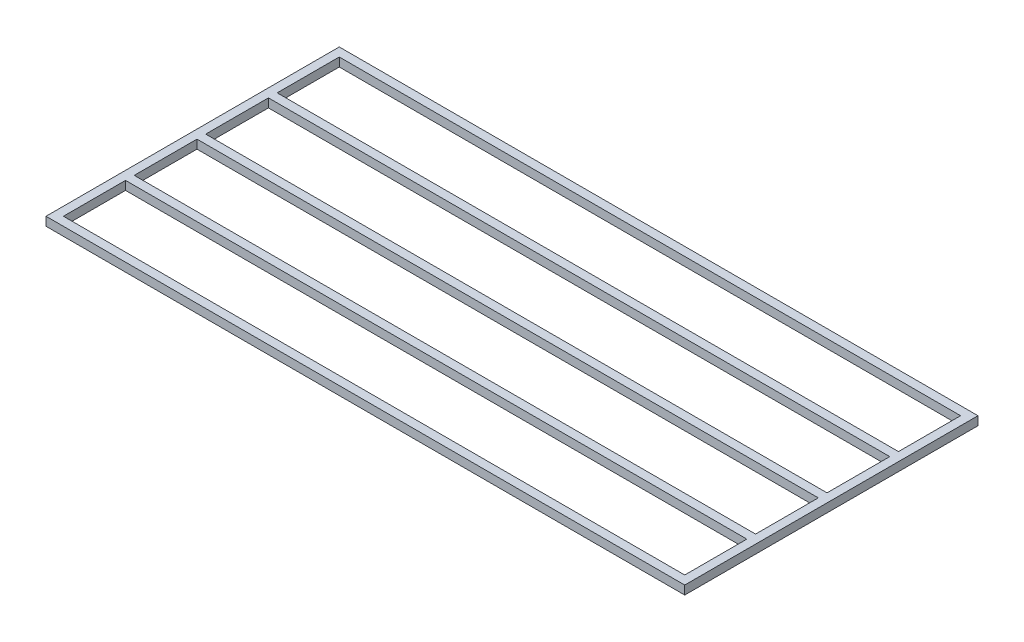
ISO-10303-21;
HEADER;
FILE_DESCRIPTION(('STEP AP214'),'2;1');
FILE_NAME('part.step','',(''),(''),'','','');
FILE_SCHEMA(('AUTOMOTIVE_DESIGN { 1 0 10303 214 1 1 1 1 }'));
ENDSEC;
DATA;
#1=APPLICATION_CONTEXT('core data for automotive mechanical design processes');
#2=APPLICATION_PROTOCOL_DEFINITION('international standard','automotive_design',2000,#1);
#3=PRODUCT_CONTEXT('',#1,'mechanical');
#4=PRODUCT('Part','Part','',(#3));
#5=PRODUCT_RELATED_PRODUCT_CATEGORY('part','',(#4));
#6=PRODUCT_DEFINITION_FORMATION('','',#4);
#7=PRODUCT_DEFINITION_CONTEXT('part definition',#1,'design');
#8=PRODUCT_DEFINITION('design','',#6,#7);
#9=PRODUCT_DEFINITION_SHAPE('','',#8);
#10=(LENGTH_UNIT() NAMED_UNIT(*) SI_UNIT(.MILLI.,.METRE.));
#11=(NAMED_UNIT(*) PLANE_ANGLE_UNIT() SI_UNIT($,.RADIAN.));
#12=(NAMED_UNIT(*) SI_UNIT($,.STERADIAN.) SOLID_ANGLE_UNIT());
#13=UNCERTAINTY_MEASURE_WITH_UNIT(LENGTH_MEASURE(1.E-05),#10,'distance_accuracy_value','');
#14=(GEOMETRIC_REPRESENTATION_CONTEXT(3) GLOBAL_UNCERTAINTY_ASSIGNED_CONTEXT((#13)) GLOBAL_UNIT_ASSIGNED_CONTEXT((#10,
#11,#12)) REPRESENTATION_CONTEXT('',''));
#15=CARTESIAN_POINT('',(0.,0.,0.));
#16=DIRECTION('',(0.,0.,1.));
#17=DIRECTION('',(1.,0.,0.));
#18=AXIS2_PLACEMENT_3D('',#15,#16,#17);
#19=CARTESIAN_POINT('',(0.,14.,0.));
#20=DIRECTION('',(0.,1.,0.));
#21=DIRECTION('',(0.,0.,1.));
#22=AXIS2_PLACEMENT_3D('',#19,#20,#21);
#23=PLANE('',#22);
#24=DIRECTION('',(0.,0.,1.));
#25=VECTOR('',#24,1.);
#26=CARTESIAN_POINT('',(-14.,14.,0.));
#27=LINE('',#26,#25);
#28=CARTESIAN_POINT('',(-14.,14.,128.));
#29=VERTEX_POINT('',#28);
#30=CARTESIAN_POINT('',(-14.,14.,229.));
#31=VERTEX_POINT('',#30);
#32=EDGE_CURVE('E301',#29,#31,#27,.T.);
#33=ORIENTED_EDGE('',*,*,#32,.T.);
#34=DIRECTION('',(1.,0.,0.));
#35=VECTOR('',#34,1.);
#36=CARTESIAN_POINT('',(0.,14.,229.));
#37=LINE('',#36,#35);
#38=CARTESIAN_POINT('',(-1014.,14.,229.));
#39=VERTEX_POINT('',#38);
#40=EDGE_CURVE('E311',#39,#31,#37,.T.);
#41=ORIENTED_EDGE('',*,*,#40,.F.);
#42=DIRECTION('',(0.,0.,1.));
#43=VECTOR('',#42,1.);
#44=CARTESIAN_POINT('',(-1014.,14.,0.));
#45=LINE('',#44,#43);
#46=CARTESIAN_POINT('',(-1014.,14.,128.));
#47=VERTEX_POINT('',#46);
#48=EDGE_CURVE('E308',#47,#39,#45,.T.);
#49=ORIENTED_EDGE('',*,*,#48,.F.);
#50=DIRECTION('',(1.,0.,0.));
#51=VECTOR('',#50,1.);
#52=CARTESIAN_POINT('',(0.,14.,128.));
#53=LINE('',#52,#51);
#54=EDGE_CURVE('E304',#47,#29,#53,.T.);
#55=ORIENTED_EDGE('',*,*,#54,.T.);
#56=EDGE_LOOP('',(#33,#41,#49,#55));
#57=FACE_BOUND('',#56,.T.);
#58=DIRECTION('',(0.,0.,1.));
#59=VECTOR('',#58,1.);
#60=CARTESIAN_POINT('',(-14.,14.,0.));
#61=LINE('',#60,#59);
#62=CARTESIAN_POINT('',(-14.,14.,243.));
#63=VERTEX_POINT('',#62);
#64=CARTESIAN_POINT('',(-14.,14.,344.));
#65=VERTEX_POINT('',#64);
#66=EDGE_CURVE('E332',#63,#65,#61,.T.);
#67=ORIENTED_EDGE('',*,*,#66,.T.);
#68=DIRECTION('',(1.,0.,0.));
#69=VECTOR('',#68,1.);
#70=CARTESIAN_POINT('',(0.,14.,344.));
#71=LINE('',#70,#69);
#72=CARTESIAN_POINT('',(-1014.,14.,344.));
#73=VERTEX_POINT('',#72);
#74=EDGE_CURVE('E342',#73,#65,#71,.T.);
#75=ORIENTED_EDGE('',*,*,#74,.F.);
#76=DIRECTION('',(0.,0.,1.));
#77=VECTOR('',#76,1.);
#78=CARTESIAN_POINT('',(-1014.,14.,0.));
#79=LINE('',#78,#77);
#80=CARTESIAN_POINT('',(-1014.,14.,243.));
#81=VERTEX_POINT('',#80);
#82=EDGE_CURVE('E339',#81,#73,#79,.T.);
#83=ORIENTED_EDGE('',*,*,#82,.F.);
#84=DIRECTION('',(1.,0.,0.));
#85=VECTOR('',#84,1.);
#86=CARTESIAN_POINT('',(0.,14.,243.));
#87=LINE('',#86,#85);
#88=EDGE_CURVE('E335',#81,#63,#87,.T.);
#89=ORIENTED_EDGE('',*,*,#88,.T.);
#90=EDGE_LOOP('',(#67,#75,#83,#89));
#91=FACE_BOUND('',#90,.T.);
#92=DIRECTION('',(0.,0.,1.));
#93=VECTOR('',#92,1.);
#94=CARTESIAN_POINT('',(-13.9999999999998,14.,0.));
#95=LINE('',#94,#93);
#96=CARTESIAN_POINT('',(-14.,14.,358.));
#97=VERTEX_POINT('',#96);
#98=CARTESIAN_POINT('',(-14.,14.,458.));
#99=VERTEX_POINT('',#98);
#100=EDGE_CURVE('E363',#97,#99,#95,.T.);
#101=ORIENTED_EDGE('',*,*,#100,.T.);
#102=DIRECTION('',(-1.,0.,0.));
#103=VECTOR('',#102,1.);
#104=CARTESIAN_POINT('',(0.,14.,458.));
#105=LINE('',#104,#103);
#106=CARTESIAN_POINT('',(-1014.,14.,458.));
#107=VERTEX_POINT('',#106);
#108=EDGE_CURVE('E373',#99,#107,#105,.T.);
#109=ORIENTED_EDGE('',*,*,#108,.T.);
#110=DIRECTION('',(0.,0.,1.));
#111=VECTOR('',#110,1.);
#112=CARTESIAN_POINT('',(-1014.,14.,0.));
#113=LINE('',#112,#111);
#114=CARTESIAN_POINT('',(-1014.,14.,358.));
#115=VERTEX_POINT('',#114);
#116=EDGE_CURVE('E370',#115,#107,#113,.T.);
#117=ORIENTED_EDGE('',*,*,#116,.F.);
#118=DIRECTION('',(1.,0.,0.));
#119=VECTOR('',#118,1.);
#120=CARTESIAN_POINT('',(0.,14.,358.));
#121=LINE('',#120,#119);
#122=EDGE_CURVE('E366',#115,#97,#121,.T.);
#123=ORIENTED_EDGE('',*,*,#122,.T.);
#124=EDGE_LOOP('',(#101,#109,#117,#123));
#125=FACE_BOUND('',#124,.T.);
#126=DIRECTION('',(-1.,0.,0.));
#127=VECTOR('',#126,1.);
#128=CARTESIAN_POINT('',(0.,14.,0.));
#129=LINE('',#128,#127);
#130=CARTESIAN_POINT('',(0.,14.,0.));
#131=VERTEX_POINT('',#130);
#132=CARTESIAN_POINT('',(-1028.,14.,0.));
#133=VERTEX_POINT('',#132);
#134=EDGE_CURVE('E395',#131,#133,#129,.T.);
#135=ORIENTED_EDGE('',*,*,#134,.T.);
#136=DIRECTION('',(0.,0.,1.));
#137=VECTOR('',#136,1.);
#138=CARTESIAN_POINT('',(-1028.,14.,0.));
#139=LINE('',#138,#137);
#140=CARTESIAN_POINT('',(-1028.,14.,472.));
#141=VERTEX_POINT('',#140);
#142=EDGE_CURVE('E398',#133,#141,#139,.T.);
#143=ORIENTED_EDGE('',*,*,#142,.T.);
#144=DIRECTION('',(-1.,0.,0.));
#145=VECTOR('',#144,1.);
#146=CARTESIAN_POINT('',(0.,14.,472.));
#147=LINE('',#146,#145);
#148=CARTESIAN_POINT('',(0.,14.,472.));
#149=VERTEX_POINT('',#148);
#150=EDGE_CURVE('E401',#149,#141,#147,.T.);
#151=ORIENTED_EDGE('',*,*,#150,.F.);
#152=DIRECTION('',(0.,0.,1.));
#153=VECTOR('',#152,1.);
#154=CARTESIAN_POINT('',(0.,14.,0.));
#155=LINE('',#154,#153);
#156=EDGE_CURVE('E404',#131,#149,#155,.T.);
#157=ORIENTED_EDGE('',*,*,#156,.F.);
#158=EDGE_LOOP('',(#135,#143,#151,#157));
#159=FACE_BOUND('',#158,.T.);
#160=DIRECTION('',(1.,0.,0.));
#161=VECTOR('',#160,1.);
#162=CARTESIAN_POINT('',(0.,14.,114.));
#163=LINE('',#162,#161);
#164=CARTESIAN_POINT('',(-1014.,14.,114.));
#165=VERTEX_POINT('',#164);
#166=CARTESIAN_POINT('',(-14.,14.,114.));
#167=VERTEX_POINT('',#166);
#168=EDGE_CURVE('E275',#165,#167,#163,.T.);
#169=ORIENTED_EDGE('',*,*,#168,.F.);
#170=DIRECTION('',(0.,0.,1.));
#171=VECTOR('',#170,1.);
#172=CARTESIAN_POINT('',(-1014.,14.,0.));
#173=LINE('',#172,#171);
#174=CARTESIAN_POINT('',(-1014.,14.,14.));
#175=VERTEX_POINT('',#174);
#176=EDGE_CURVE('E267',#175,#165,#173,.T.);
#177=ORIENTED_EDGE('',*,*,#176,.F.);
#178=DIRECTION('',(-1.,0.,0.));
#179=VECTOR('',#178,1.);
#180=CARTESIAN_POINT('',(0.,14.,14.));
#181=LINE('',#180,#179);
#182=CARTESIAN_POINT('',(-14.,14.,14.));
#183=VERTEX_POINT('',#182);
#184=EDGE_CURVE('E286',#183,#175,#181,.T.);
#185=ORIENTED_EDGE('',*,*,#184,.F.);
#186=DIRECTION('',(0.,0.,1.));
#187=VECTOR('',#186,1.);
#188=CARTESIAN_POINT('',(-14.,14.,0.));
#189=LINE('',#188,#187);
#190=EDGE_CURVE('E144',#183,#167,#189,.T.);
#191=ORIENTED_EDGE('',*,*,#190,.T.);
#192=EDGE_LOOP('',(#169,#177,#185,#191));
#193=FACE_BOUND('',#192,.T.);
#194=ADVANCED_FACE('F129',(#57,#91,#125,#159,#193),#23,.T.);
#195=CARTESIAN_POINT('',(0.,0.,0.));
#196=DIRECTION('',(0.,1.,0.));
#197=DIRECTION('',(0.,0.,1.));
#198=AXIS2_PLACEMENT_3D('',#195,#196,#197);
#199=PLANE('',#198);
#200=DIRECTION('',(-1.,0.,0.));
#201=VECTOR('',#200,1.);
#202=CARTESIAN_POINT('',(0.,0.,0.));
#203=LINE('',#202,#201);
#204=CARTESIAN_POINT('',(0.,0.,0.));
#205=VERTEX_POINT('',#204);
#206=CARTESIAN_POINT('',(-1028.,0.,0.));
#207=VERTEX_POINT('',#206);
#208=EDGE_CURVE('E394',#205,#207,#203,.T.);
#209=ORIENTED_EDGE('',*,*,#208,.F.);
#210=DIRECTION('',(0.,0.,1.));
#211=VECTOR('',#210,1.);
#212=CARTESIAN_POINT('',(0.,0.,0.));
#213=LINE('',#212,#211);
#214=CARTESIAN_POINT('',(0.,0.,472.));
#215=VERTEX_POINT('',#214);
#216=EDGE_CURVE('E399',#205,#215,#213,.T.);
#217=ORIENTED_EDGE('',*,*,#216,.T.);
#218=DIRECTION('',(-1.,0.,0.));
#219=VECTOR('',#218,1.);
#220=CARTESIAN_POINT('',(0.,0.,472.));
#221=LINE('',#220,#219);
#222=CARTESIAN_POINT('',(-1028.,0.,472.));
#223=VERTEX_POINT('',#222);
#224=EDGE_CURVE('E413',#215,#223,#221,.T.);
#225=ORIENTED_EDGE('',*,*,#224,.T.);
#226=DIRECTION('',(0.,0.,1.));
#227=VECTOR('',#226,1.);
#228=CARTESIAN_POINT('',(-1028.,0.,0.));
#229=LINE('',#228,#227);
#230=EDGE_CURVE('E410',#207,#223,#229,.T.);
#231=ORIENTED_EDGE('',*,*,#230,.F.);
#232=EDGE_LOOP('',(#209,#217,#225,#231));
#233=FACE_BOUND('',#232,.T.);
#234=DIRECTION('',(-1.,0.,0.));
#235=VECTOR('',#234,1.);
#236=CARTESIAN_POINT('',(0.,0.,458.));
#237=LINE('',#236,#235);
#238=CARTESIAN_POINT('',(-14.,0.,458.));
#239=VERTEX_POINT('',#238);
#240=CARTESIAN_POINT('',(-1014.,0.,458.));
#241=VERTEX_POINT('',#240);
#242=EDGE_CURVE('E367',#239,#241,#237,.T.);
#243=ORIENTED_EDGE('',*,*,#242,.F.);
#244=DIRECTION('',(0.,0.,1.));
#245=VECTOR('',#244,1.);
#246=CARTESIAN_POINT('',(-13.9999999999998,0.,0.));
#247=LINE('',#246,#245);
#248=CARTESIAN_POINT('',(-14.,0.,358.));
#249=VERTEX_POINT('',#248);
#250=EDGE_CURVE('E362',#249,#239,#247,.T.);
#251=ORIENTED_EDGE('',*,*,#250,.F.);
#252=DIRECTION('',(1.,0.,0.));
#253=VECTOR('',#252,1.);
#254=CARTESIAN_POINT('',(0.,0.,358.));
#255=LINE('',#254,#253);
#256=CARTESIAN_POINT('',(-1014.,0.,358.));
#257=VERTEX_POINT('',#256);
#258=EDGE_CURVE('E378',#257,#249,#255,.T.);
#259=ORIENTED_EDGE('',*,*,#258,.F.);
#260=DIRECTION('',(0.,0.,1.));
#261=VECTOR('',#260,1.);
#262=CARTESIAN_POINT('',(-1014.,0.,0.));
#263=LINE('',#262,#261);
#264=EDGE_CURVE('E381',#257,#241,#263,.T.);
#265=ORIENTED_EDGE('',*,*,#264,.T.);
#266=EDGE_LOOP('',(#243,#251,#259,#265));
#267=FACE_BOUND('',#266,.T.);
#268=DIRECTION('',(1.,0.,0.));
#269=VECTOR('',#268,1.);
#270=CARTESIAN_POINT('',(0.,0.,344.));
#271=LINE('',#270,#269);
#272=CARTESIAN_POINT('',(-1014.,0.,344.));
#273=VERTEX_POINT('',#272);
#274=CARTESIAN_POINT('',(-14.,0.,344.));
#275=VERTEX_POINT('',#274);
#276=EDGE_CURVE('E336',#273,#275,#271,.T.);
#277=ORIENTED_EDGE('',*,*,#276,.T.);
#278=DIRECTION('',(0.,0.,1.));
#279=VECTOR('',#278,1.);
#280=CARTESIAN_POINT('',(-14.,0.,0.));
#281=LINE('',#280,#279);
#282=CARTESIAN_POINT('',(-14.,0.,243.));
#283=VERTEX_POINT('',#282);
#284=EDGE_CURVE('E331',#283,#275,#281,.T.);
#285=ORIENTED_EDGE('',*,*,#284,.F.);
#286=DIRECTION('',(1.,0.,0.));
#287=VECTOR('',#286,1.);
#288=CARTESIAN_POINT('',(0.,0.,243.));
#289=LINE('',#288,#287);
#290=CARTESIAN_POINT('',(-1014.,0.,243.));
#291=VERTEX_POINT('',#290);
#292=EDGE_CURVE('E346',#291,#283,#289,.T.);
#293=ORIENTED_EDGE('',*,*,#292,.F.);
#294=DIRECTION('',(0.,0.,1.));
#295=VECTOR('',#294,1.);
#296=CARTESIAN_POINT('',(-1014.,0.,0.));
#297=LINE('',#296,#295);
#298=EDGE_CURVE('E349',#291,#273,#297,.T.);
#299=ORIENTED_EDGE('',*,*,#298,.T.);
#300=EDGE_LOOP('',(#277,#285,#293,#299));
#301=FACE_BOUND('',#300,.T.);
#302=DIRECTION('',(1.,0.,0.));
#303=VECTOR('',#302,1.);
#304=CARTESIAN_POINT('',(0.,0.,229.));
#305=LINE('',#304,#303);
#306=CARTESIAN_POINT('',(-1014.,0.,229.));
#307=VERTEX_POINT('',#306);
#308=CARTESIAN_POINT('',(-14.,0.,229.));
#309=VERTEX_POINT('',#308);
#310=EDGE_CURVE('E305',#307,#309,#305,.T.);
#311=ORIENTED_EDGE('',*,*,#310,.T.);
#312=DIRECTION('',(0.,0.,1.));
#313=VECTOR('',#312,1.);
#314=CARTESIAN_POINT('',(-14.,0.,0.));
#315=LINE('',#314,#313);
#316=CARTESIAN_POINT('',(-14.,0.,128.));
#317=VERTEX_POINT('',#316);
#318=EDGE_CURVE('E282',#317,#309,#315,.T.);
#319=ORIENTED_EDGE('',*,*,#318,.F.);
#320=DIRECTION('',(1.,0.,0.));
#321=VECTOR('',#320,1.);
#322=CARTESIAN_POINT('',(0.,0.,128.));
#323=LINE('',#322,#321);
#324=CARTESIAN_POINT('',(-1014.,0.,128.));
#325=VERTEX_POINT('',#324);
#326=EDGE_CURVE('E315',#325,#317,#323,.T.);
#327=ORIENTED_EDGE('',*,*,#326,.F.);
#328=DIRECTION('',(0.,0.,1.));
#329=VECTOR('',#328,1.);
#330=CARTESIAN_POINT('',(-1014.,0.,0.));
#331=LINE('',#330,#329);
#332=EDGE_CURVE('E318',#325,#307,#331,.T.);
#333=ORIENTED_EDGE('',*,*,#332,.T.);
#334=EDGE_LOOP('',(#311,#319,#327,#333));
#335=FACE_BOUND('',#334,.T.);
#336=DIRECTION('',(0.,0.,1.));
#337=VECTOR('',#336,1.);
#338=CARTESIAN_POINT('',(-1014.,0.,0.));
#339=LINE('',#338,#337);
#340=CARTESIAN_POINT('',(-1014.,0.,14.));
#341=VERTEX_POINT('',#340);
#342=CARTESIAN_POINT('',(-1014.,0.,114.));
#343=VERTEX_POINT('',#342);
#344=EDGE_CURVE('E152',#341,#343,#339,.T.);
#345=ORIENTED_EDGE('',*,*,#344,.T.);
#346=DIRECTION('',(1.,0.,0.));
#347=VECTOR('',#346,1.);
#348=CARTESIAN_POINT('',(0.,0.,114.));
#349=LINE('',#348,#347);
#350=CARTESIAN_POINT('',(-14.,0.,114.));
#351=VERTEX_POINT('',#350);
#352=EDGE_CURVE('E281',#343,#351,#349,.T.);
#353=ORIENTED_EDGE('',*,*,#352,.T.);
#354=DIRECTION('',(0.,0.,1.));
#355=VECTOR('',#354,1.);
#356=CARTESIAN_POINT('',(-14.,0.,0.));
#357=LINE('',#356,#355);
#358=CARTESIAN_POINT('',(-14.,0.,14.));
#359=VERTEX_POINT('',#358);
#360=EDGE_CURVE('E292',#359,#351,#357,.T.);
#361=ORIENTED_EDGE('',*,*,#360,.F.);
#362=DIRECTION('',(-1.,0.,0.));
#363=VECTOR('',#362,1.);
#364=CARTESIAN_POINT('',(0.,0.,14.));
#365=LINE('',#364,#363);
#366=EDGE_CURVE('E276',#359,#341,#365,.T.);
#367=ORIENTED_EDGE('',*,*,#366,.T.);
#368=EDGE_LOOP('',(#345,#353,#361,#367));
#369=FACE_BOUND('',#368,.T.);
#370=ADVANCED_FACE('F430',(#233,#267,#301,#335,#369),#199,.F.);
#371=CARTESIAN_POINT('',(0.,14.,0.));
#372=DIRECTION('',(0.,0.,1.));
#373=DIRECTION('',(1.,0.,0.));
#374=AXIS2_PLACEMENT_3D('',#371,#372,#373);
#375=PLANE('',#374);
#376=ORIENTED_EDGE('',*,*,#208,.T.);
#377=DIRECTION('',(0.,-1.,0.));
#378=VECTOR('',#377,1.);
#379=CARTESIAN_POINT('',(-1028.,14.,0.));
#380=LINE('',#379,#378);
#381=EDGE_CURVE('E12',#133,#207,#380,.T.);
#382=ORIENTED_EDGE('',*,*,#381,.F.);
#383=ORIENTED_EDGE('',*,*,#134,.F.);
#384=DIRECTION('',(0.,-1.,0.));
#385=VECTOR('',#384,1.);
#386=CARTESIAN_POINT('',(0.,14.,0.));
#387=LINE('',#386,#385);
#388=EDGE_CURVE('E407',#131,#205,#387,.T.);
#389=ORIENTED_EDGE('',*,*,#388,.T.);
#390=EDGE_LOOP('',(#376,#382,#383,#389));
#391=FACE_BOUND('',#390,.T.);
#392=ADVANCED_FACE('F131',(#391),#375,.F.);
#393=CARTESIAN_POINT('',(-1028.,14.,0.));
#394=DIRECTION('',(1.,0.,0.));
#395=DIRECTION('',(0.,0.,-1.));
#396=AXIS2_PLACEMENT_3D('',#393,#394,#395);
#397=PLANE('',#396);
#398=ORIENTED_EDGE('',*,*,#230,.T.);
#399=DIRECTION('',(0.,-1.,0.));
#400=VECTOR('',#399,1.);
#401=CARTESIAN_POINT('',(-1028.,14.,472.));
#402=LINE('',#401,#400);
#403=EDGE_CURVE('E137',#141,#223,#402,.T.);
#404=ORIENTED_EDGE('',*,*,#403,.F.);
#405=ORIENTED_EDGE('',*,*,#142,.F.);
#406=ORIENTED_EDGE('',*,*,#381,.T.);
#407=EDGE_LOOP('',(#398,#404,#405,#406));
#408=FACE_BOUND('',#407,.T.);
#409=ADVANCED_FACE('F426',(#408),#397,.F.);
#410=CARTESIAN_POINT('',(0.,14.,472.));
#411=DIRECTION('',(0.,0.,1.));
#412=DIRECTION('',(1.,0.,0.));
#413=AXIS2_PLACEMENT_3D('',#410,#411,#412);
#414=PLANE('',#413);
#415=ORIENTED_EDGE('',*,*,#224,.F.);
#416=DIRECTION('',(0.,-1.,0.));
#417=VECTOR('',#416,1.);
#418=CARTESIAN_POINT('',(0.,14.,472.));
#419=LINE('',#418,#417);
#420=EDGE_CURVE('E419',#149,#215,#419,.T.);
#421=ORIENTED_EDGE('',*,*,#420,.F.);
#422=ORIENTED_EDGE('',*,*,#150,.T.);
#423=ORIENTED_EDGE('',*,*,#403,.T.);
#424=EDGE_LOOP('',(#415,#421,#422,#423));
#425=FACE_BOUND('',#424,.T.);
#426=ADVANCED_FACE('F423',(#425),#414,.T.);
#427=CARTESIAN_POINT('',(0.,14.,0.));
#428=DIRECTION('',(1.,0.,0.));
#429=DIRECTION('',(0.,0.,-1.));
#430=AXIS2_PLACEMENT_3D('',#427,#428,#429);
#431=PLANE('',#430);
#432=ORIENTED_EDGE('',*,*,#216,.F.);
#433=ORIENTED_EDGE('',*,*,#388,.F.);
#434=ORIENTED_EDGE('',*,*,#156,.T.);
#435=ORIENTED_EDGE('',*,*,#420,.T.);
#436=EDGE_LOOP('',(#432,#433,#434,#435));
#437=FACE_BOUND('',#436,.T.);
#438=ADVANCED_FACE('F434',(#437),#431,.T.);
#439=CARTESIAN_POINT('',(-13.9999999999998,14.,0.));
#440=DIRECTION('',(1.,0.,0.));
#441=DIRECTION('',(0.,0.,-1.));
#442=AXIS2_PLACEMENT_3D('',#439,#440,#441);
#443=PLANE('',#442);
#444=ORIENTED_EDGE('',*,*,#250,.T.);
#445=DIRECTION('',(0.,-1.,0.));
#446=VECTOR('',#445,1.);
#447=CARTESIAN_POINT('',(-14.,14.,458.));
#448=LINE('',#447,#446);
#449=EDGE_CURVE('E376',#99,#239,#448,.T.);
#450=ORIENTED_EDGE('',*,*,#449,.F.);
#451=ORIENTED_EDGE('',*,*,#100,.F.);
#452=DIRECTION('',(0.,-1.,0.));
#453=VECTOR('',#452,1.);
#454=CARTESIAN_POINT('',(-14.,14.,358.));
#455=LINE('',#454,#453);
#456=EDGE_CURVE('E392',#97,#249,#455,.T.);
#457=ORIENTED_EDGE('',*,*,#456,.T.);
#458=EDGE_LOOP('',(#444,#450,#451,#457));
#459=FACE_BOUND('',#458,.T.);
#460=ADVANCED_FACE('F452',(#459),#443,.F.);
#461=CARTESIAN_POINT('',(0.,14.,358.));
#462=DIRECTION('',(0.,0.,-1.));
#463=DIRECTION('',(-1.,0.,0.));
#464=AXIS2_PLACEMENT_3D('',#461,#462,#463);
#465=PLANE('',#464);
#466=ORIENTED_EDGE('',*,*,#258,.T.);
#467=ORIENTED_EDGE('',*,*,#456,.F.);
#468=ORIENTED_EDGE('',*,*,#122,.F.);
#469=DIRECTION('',(0.,-1.,0.));
#470=VECTOR('',#469,1.);
#471=CARTESIAN_POINT('',(-1014.,14.,358.));
#472=LINE('',#471,#470);
#473=EDGE_CURVE('E390',#115,#257,#472,.T.);
#474=ORIENTED_EDGE('',*,*,#473,.T.);
#475=EDGE_LOOP('',(#466,#467,#468,#474));
#476=FACE_BOUND('',#475,.T.);
#477=ADVANCED_FACE('F472',(#476),#465,.F.);
#478=CARTESIAN_POINT('',(-1014.,14.,0.));
#479=DIRECTION('',(1.,0.,0.));
#480=DIRECTION('',(0.,0.,-1.));
#481=AXIS2_PLACEMENT_3D('',#478,#479,#480);
#482=PLANE('',#481);
#483=ORIENTED_EDGE('',*,*,#264,.F.);
#484=ORIENTED_EDGE('',*,*,#473,.F.);
#485=ORIENTED_EDGE('',*,*,#116,.T.);
#486=DIRECTION('',(0.,-1.,0.));
#487=VECTOR('',#486,1.);
#488=CARTESIAN_POINT('',(-1014.,14.,458.));
#489=LINE('',#488,#487);
#490=EDGE_CURVE('E388',#107,#241,#489,.T.);
#491=ORIENTED_EDGE('',*,*,#490,.T.);
#492=EDGE_LOOP('',(#483,#484,#485,#491));
#493=FACE_BOUND('',#492,.T.);
#494=ADVANCED_FACE('F479',(#493),#482,.T.);
#495=CARTESIAN_POINT('',(0.,14.,458.));
#496=DIRECTION('',(0.,0.,1.));
#497=DIRECTION('',(1.,0.,0.));
#498=AXIS2_PLACEMENT_3D('',#495,#496,#497);
#499=PLANE('',#498);
#500=ORIENTED_EDGE('',*,*,#242,.T.);
#501=ORIENTED_EDGE('',*,*,#490,.F.);
#502=ORIENTED_EDGE('',*,*,#108,.F.);
#503=ORIENTED_EDGE('',*,*,#449,.T.);
#504=EDGE_LOOP('',(#500,#501,#502,#503));
#505=FACE_BOUND('',#504,.T.);
#506=ADVANCED_FACE('F486',(#505),#499,.F.);
#507=CARTESIAN_POINT('',(-14.,14.,0.));
#508=DIRECTION('',(1.,0.,0.));
#509=DIRECTION('',(0.,0.,-1.));
#510=AXIS2_PLACEMENT_3D('',#507,#508,#509);
#511=PLANE('',#510);
#512=ORIENTED_EDGE('',*,*,#284,.T.);
#513=DIRECTION('',(0.,-1.,0.));
#514=VECTOR('',#513,1.);
#515=CARTESIAN_POINT('',(-14.,14.,344.));
#516=LINE('',#515,#514);
#517=EDGE_CURVE('E344',#65,#275,#516,.T.);
#518=ORIENTED_EDGE('',*,*,#517,.F.);
#519=ORIENTED_EDGE('',*,*,#66,.F.);
#520=DIRECTION('',(0.,-1.,0.));
#521=VECTOR('',#520,1.);
#522=CARTESIAN_POINT('',(-14.,14.,243.));
#523=LINE('',#522,#521);
#524=EDGE_CURVE('E360',#63,#283,#523,.T.);
#525=ORIENTED_EDGE('',*,*,#524,.T.);
#526=EDGE_LOOP('',(#512,#518,#519,#525));
#527=FACE_BOUND('',#526,.T.);
#528=ADVANCED_FACE('F494',(#527),#511,.F.);
#529=CARTESIAN_POINT('',(0.,14.,243.));
#530=DIRECTION('',(0.,0.,-1.));
#531=DIRECTION('',(-1.,0.,0.));
#532=AXIS2_PLACEMENT_3D('',#529,#530,#531);
#533=PLANE('',#532);
#534=ORIENTED_EDGE('',*,*,#292,.T.);
#535=ORIENTED_EDGE('',*,*,#524,.F.);
#536=ORIENTED_EDGE('',*,*,#88,.F.);
#537=DIRECTION('',(0.,-1.,0.));
#538=VECTOR('',#537,1.);
#539=CARTESIAN_POINT('',(-1014.,14.,243.));
#540=LINE('',#539,#538);
#541=EDGE_CURVE('E358',#81,#291,#540,.T.);
#542=ORIENTED_EDGE('',*,*,#541,.T.);
#543=EDGE_LOOP('',(#534,#535,#536,#542));
#544=FACE_BOUND('',#543,.T.);
#545=ADVANCED_FACE('F502',(#544),#533,.F.);
#546=CARTESIAN_POINT('',(-1014.,14.,0.));
#547=DIRECTION('',(1.,0.,0.));
#548=DIRECTION('',(0.,0.,-1.));
#549=AXIS2_PLACEMENT_3D('',#546,#547,#548);
#550=PLANE('',#549);
#551=ORIENTED_EDGE('',*,*,#298,.F.);
#552=ORIENTED_EDGE('',*,*,#541,.F.);
#553=ORIENTED_EDGE('',*,*,#82,.T.);
#554=DIRECTION('',(0.,-1.,0.));
#555=VECTOR('',#554,1.);
#556=CARTESIAN_POINT('',(-1014.,14.,344.));
#557=LINE('',#556,#555);
#558=EDGE_CURVE('E356',#73,#273,#557,.T.);
#559=ORIENTED_EDGE('',*,*,#558,.T.);
#560=EDGE_LOOP('',(#551,#552,#553,#559));
#561=FACE_BOUND('',#560,.T.);
#562=ADVANCED_FACE('F510',(#561),#550,.T.);
#563=CARTESIAN_POINT('',(0.,14.,344.));
#564=DIRECTION('',(0.,0.,-1.));
#565=DIRECTION('',(-1.,0.,0.));
#566=AXIS2_PLACEMENT_3D('',#563,#564,#565);
#567=PLANE('',#566);
#568=ORIENTED_EDGE('',*,*,#276,.F.);
#569=ORIENTED_EDGE('',*,*,#558,.F.);
#570=ORIENTED_EDGE('',*,*,#74,.T.);
#571=ORIENTED_EDGE('',*,*,#517,.T.);
#572=EDGE_LOOP('',(#568,#569,#570,#571));
#573=FACE_BOUND('',#572,.T.);
#574=ADVANCED_FACE('F518',(#573),#567,.T.);
#575=CARTESIAN_POINT('',(-14.,14.,0.));
#576=DIRECTION('',(1.,0.,0.));
#577=DIRECTION('',(0.,0.,-1.));
#578=AXIS2_PLACEMENT_3D('',#575,#576,#577);
#579=PLANE('',#578);
#580=ORIENTED_EDGE('',*,*,#318,.T.);
#581=DIRECTION('',(0.,-1.,0.));
#582=VECTOR('',#581,1.);
#583=CARTESIAN_POINT('',(-14.,14.,229.));
#584=LINE('',#583,#582);
#585=EDGE_CURVE('E313',#31,#309,#584,.T.);
#586=ORIENTED_EDGE('',*,*,#585,.F.);
#587=ORIENTED_EDGE('',*,*,#32,.F.);
#588=DIRECTION('',(0.,-1.,0.));
#589=VECTOR('',#588,1.);
#590=CARTESIAN_POINT('',(-14.,14.,128.));
#591=LINE('',#590,#589);
#592=EDGE_CURVE('E329',#29,#317,#591,.T.);
#593=ORIENTED_EDGE('',*,*,#592,.T.);
#594=EDGE_LOOP('',(#580,#586,#587,#593));
#595=FACE_BOUND('',#594,.T.);
#596=ADVANCED_FACE('F526',(#595),#579,.F.);
#597=CARTESIAN_POINT('',(0.,14.,128.));
#598=DIRECTION('',(0.,0.,-1.));
#599=DIRECTION('',(-1.,0.,0.));
#600=AXIS2_PLACEMENT_3D('',#597,#598,#599);
#601=PLANE('',#600);
#602=ORIENTED_EDGE('',*,*,#326,.T.);
#603=ORIENTED_EDGE('',*,*,#592,.F.);
#604=ORIENTED_EDGE('',*,*,#54,.F.);
#605=DIRECTION('',(0.,-1.,0.));
#606=VECTOR('',#605,1.);
#607=CARTESIAN_POINT('',(-1014.,14.,128.));
#608=LINE('',#607,#606);
#609=EDGE_CURVE('E327',#47,#325,#608,.T.);
#610=ORIENTED_EDGE('',*,*,#609,.T.);
#611=EDGE_LOOP('',(#602,#603,#604,#610));
#612=FACE_BOUND('',#611,.T.);
#613=ADVANCED_FACE('F534',(#612),#601,.F.);
#614=CARTESIAN_POINT('',(-1014.,14.,0.));
#615=DIRECTION('',(1.,0.,0.));
#616=DIRECTION('',(0.,0.,-1.));
#617=AXIS2_PLACEMENT_3D('',#614,#615,#616);
#618=PLANE('',#617);
#619=ORIENTED_EDGE('',*,*,#332,.F.);
#620=ORIENTED_EDGE('',*,*,#609,.F.);
#621=ORIENTED_EDGE('',*,*,#48,.T.);
#622=DIRECTION('',(0.,-1.,0.));
#623=VECTOR('',#622,1.);
#624=CARTESIAN_POINT('',(-1014.,14.,229.));
#625=LINE('',#624,#623);
#626=EDGE_CURVE('E325',#39,#307,#625,.T.);
#627=ORIENTED_EDGE('',*,*,#626,.T.);
#628=EDGE_LOOP('',(#619,#620,#621,#627));
#629=FACE_BOUND('',#628,.T.);
#630=ADVANCED_FACE('F542',(#629),#618,.T.);
#631=CARTESIAN_POINT('',(0.,14.,229.));
#632=DIRECTION('',(0.,0.,-1.));
#633=DIRECTION('',(-1.,0.,0.));
#634=AXIS2_PLACEMENT_3D('',#631,#632,#633);
#635=PLANE('',#634);
#636=ORIENTED_EDGE('',*,*,#310,.F.);
#637=ORIENTED_EDGE('',*,*,#626,.F.);
#638=ORIENTED_EDGE('',*,*,#40,.T.);
#639=ORIENTED_EDGE('',*,*,#585,.T.);
#640=EDGE_LOOP('',(#636,#637,#638,#639));
#641=FACE_BOUND('',#640,.T.);
#642=ADVANCED_FACE('F550',(#641),#635,.T.);
#643=CARTESIAN_POINT('',(-1014.,14.,0.));
#644=DIRECTION('',(1.,0.,0.));
#645=DIRECTION('',(0.,0.,-1.));
#646=AXIS2_PLACEMENT_3D('',#643,#644,#645);
#647=PLANE('',#646);
#648=ORIENTED_EDGE('',*,*,#344,.F.);
#649=DIRECTION('',(0.,-1.,0.));
#650=VECTOR('',#649,1.);
#651=CARTESIAN_POINT('',(-1014.,14.,14.));
#652=LINE('',#651,#650);
#653=EDGE_CURVE('E271',#175,#341,#652,.T.);
#654=ORIENTED_EDGE('',*,*,#653,.F.);
#655=ORIENTED_EDGE('',*,*,#176,.T.);
#656=DIRECTION('',(0.,-1.,0.));
#657=VECTOR('',#656,1.);
#658=CARTESIAN_POINT('',(-1014.,14.,114.));
#659=LINE('',#658,#657);
#660=EDGE_CURVE('E270',#165,#343,#659,.T.);
#661=ORIENTED_EDGE('',*,*,#660,.T.);
#662=EDGE_LOOP('',(#648,#654,#655,#661));
#663=FACE_BOUND('',#662,.T.);
#664=ADVANCED_FACE('F269',(#663),#647,.T.);
#665=CARTESIAN_POINT('',(0.,14.,114.));
#666=DIRECTION('',(0.,0.,-1.));
#667=DIRECTION('',(-1.,0.,0.));
#668=AXIS2_PLACEMENT_3D('',#665,#666,#667);
#669=PLANE('',#668);
#670=ORIENTED_EDGE('',*,*,#352,.F.);
#671=ORIENTED_EDGE('',*,*,#660,.F.);
#672=ORIENTED_EDGE('',*,*,#168,.T.);
#673=DIRECTION('',(0.,-1.,0.));
#674=VECTOR('',#673,1.);
#675=CARTESIAN_POINT('',(-14.,14.,114.));
#676=LINE('',#675,#674);
#677=EDGE_CURVE('E283',#167,#351,#676,.T.);
#678=ORIENTED_EDGE('',*,*,#677,.T.);
#679=EDGE_LOOP('',(#670,#671,#672,#678));
#680=FACE_BOUND('',#679,.T.);
#681=ADVANCED_FACE('F279',(#680),#669,.T.);
#682=CARTESIAN_POINT('',(-14.,14.,0.));
#683=DIRECTION('',(1.,0.,0.));
#684=DIRECTION('',(0.,0.,-1.));
#685=AXIS2_PLACEMENT_3D('',#682,#683,#684);
#686=PLANE('',#685);
#687=ORIENTED_EDGE('',*,*,#360,.T.);
#688=ORIENTED_EDGE('',*,*,#677,.F.);
#689=ORIENTED_EDGE('',*,*,#190,.F.);
#690=DIRECTION('',(0.,-1.,0.));
#691=VECTOR('',#690,1.);
#692=CARTESIAN_POINT('',(-14.,14.,14.));
#693=LINE('',#692,#691);
#694=EDGE_CURVE('E298',#183,#359,#693,.T.);
#695=ORIENTED_EDGE('',*,*,#694,.T.);
#696=EDGE_LOOP('',(#687,#688,#689,#695));
#697=FACE_BOUND('',#696,.T.);
#698=ADVANCED_FACE('F571',(#697),#686,.F.);
#699=CARTESIAN_POINT('',(0.,14.,14.));
#700=DIRECTION('',(0.,0.,1.));
#701=DIRECTION('',(1.,0.,0.));
#702=AXIS2_PLACEMENT_3D('',#699,#700,#701);
#703=PLANE('',#702);
#704=ORIENTED_EDGE('',*,*,#366,.F.);
#705=ORIENTED_EDGE('',*,*,#694,.F.);
#706=ORIENTED_EDGE('',*,*,#184,.T.);
#707=ORIENTED_EDGE('',*,*,#653,.T.);
#708=EDGE_LOOP('',(#704,#705,#706,#707));
#709=FACE_BOUND('',#708,.T.);
#710=ADVANCED_FACE('F578',(#709),#703,.T.);
#711=CLOSED_SHELL('',(#194,#370,#392,#409,#426,#438,#460,#477,#494,#506,#528,#545,#562,#574,
#596,#613,#630,#642,#664,#681,#698,#710));
#712=MANIFOLD_SOLID_BREP('B2',#711);
#713=ADVANCED_BREP_SHAPE_REPRESENTATION('',(#18,#712),#14);
#714=SHAPE_DEFINITION_REPRESENTATION(#9,#713);
ENDSEC;
END-ISO-10303-21;
